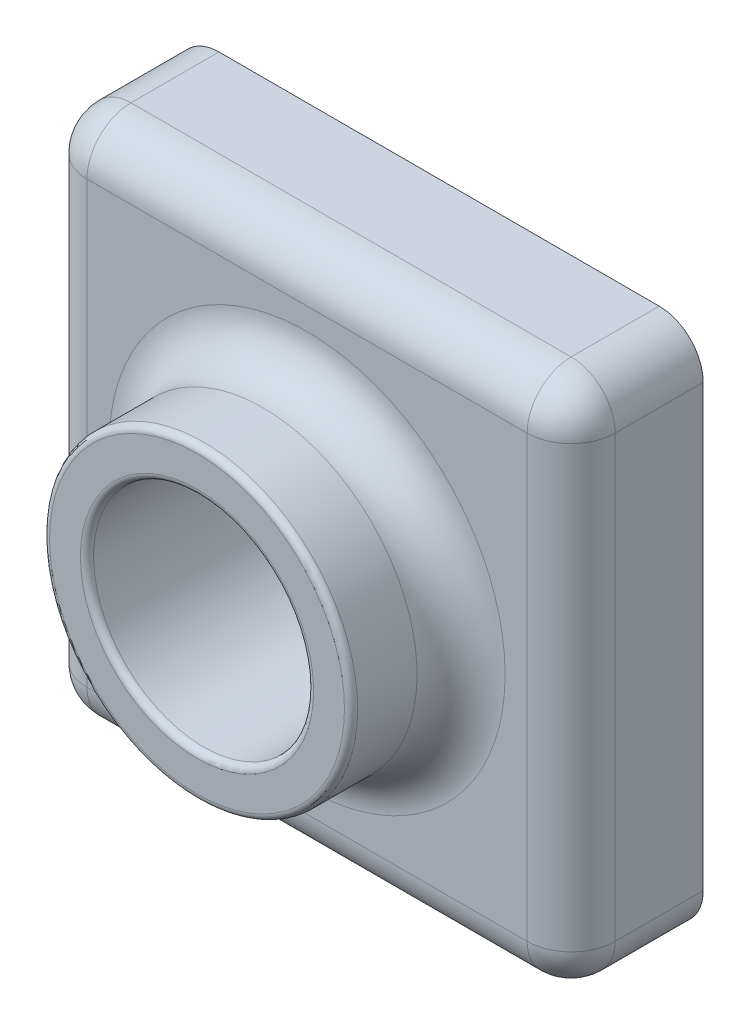
ISO-10303-21;
HEADER;
FILE_DESCRIPTION(('STEP AP214'),'2;1');
FILE_NAME('part.step','',(''),(''),'','','');
FILE_SCHEMA(('AUTOMOTIVE_DESIGN { 1 0 10303 214 1 1 1 1 }'));
ENDSEC;
DATA;
#1=APPLICATION_CONTEXT('core data for automotive mechanical design processes');
#2=APPLICATION_PROTOCOL_DEFINITION('international standard','automotive_design',2000,#1);
#3=PRODUCT_CONTEXT('',#1,'mechanical');
#4=PRODUCT('Part','Part','',(#3));
#5=PRODUCT_RELATED_PRODUCT_CATEGORY('part','',(#4));
#6=PRODUCT_DEFINITION_FORMATION('','',#4);
#7=PRODUCT_DEFINITION_CONTEXT('part definition',#1,'design');
#8=PRODUCT_DEFINITION('design','',#6,#7);
#9=PRODUCT_DEFINITION_SHAPE('','',#8);
#10=(LENGTH_UNIT() NAMED_UNIT(*) SI_UNIT(.MILLI.,.METRE.));
#11=(NAMED_UNIT(*) PLANE_ANGLE_UNIT() SI_UNIT($,.RADIAN.));
#12=(NAMED_UNIT(*) SI_UNIT($,.STERADIAN.) SOLID_ANGLE_UNIT());
#13=UNCERTAINTY_MEASURE_WITH_UNIT(LENGTH_MEASURE(1.E-05),#10,'distance_accuracy_value','');
#14=(GEOMETRIC_REPRESENTATION_CONTEXT(3) GLOBAL_UNCERTAINTY_ASSIGNED_CONTEXT((#13)) GLOBAL_UNIT_ASSIGNED_CONTEXT((#10,
#11,#12)) REPRESENTATION_CONTEXT('',''));
#15=CARTESIAN_POINT('',(0.,0.,0.));
#16=DIRECTION('',(0.,0.,1.));
#17=DIRECTION('',(1.,0.,0.));
#18=AXIS2_PLACEMENT_3D('',#15,#16,#17);
#19=CARTESIAN_POINT('',(0.,0.,0.));
#20=DIRECTION('',(0.,0.,-1.));
#21=DIRECTION('',(-1.,0.,0.));
#22=AXIS2_PLACEMENT_3D('',#19,#20,#21);
#23=PLANE('',#22);
#24=DIRECTION('',(1.,0.,0.));
#25=VECTOR('',#24,1.);
#26=CARTESIAN_POINT('',(0.,-120.,0.));
#27=LINE('',#26,#25);
#28=CARTESIAN_POINT('',(-110.,-120.,0.));
#29=VERTEX_POINT('',#28);
#30=CARTESIAN_POINT('',(-9.99999999999998,-120.,0.));
#31=VERTEX_POINT('',#30);
#32=EDGE_CURVE('E275',#29,#31,#27,.T.);
#33=ORIENTED_EDGE('',*,*,#32,.F.);
#34=CARTESIAN_POINT('',(-110.,-110.,0.));
#35=DIRECTION('',(0.,0.,-1.));
#36=DIRECTION('',(-1.,0.,0.));
#37=AXIS2_PLACEMENT_3D('',#34,#35,#36);
#38=CIRCLE('',#37,10.);
#39=CARTESIAN_POINT('',(-120.,-110.,0.));
#40=VERTEX_POINT('',#39);
#41=EDGE_CURVE('E319',#29,#40,#38,.T.);
#42=ORIENTED_EDGE('',*,*,#41,.T.);
#43=DIRECTION('',(0.,-1.,0.));
#44=VECTOR('',#43,1.);
#45=CARTESIAN_POINT('',(-120.,0.,0.));
#46=LINE('',#45,#44);
#47=CARTESIAN_POINT('',(-120.,-10.,0.));
#48=VERTEX_POINT('',#47);
#49=EDGE_CURVE('E271',#48,#40,#46,.T.);
#50=ORIENTED_EDGE('',*,*,#49,.F.);
#51=CARTESIAN_POINT('',(-110.,-10.,0.));
#52=DIRECTION('',(0.,0.,-1.));
#53=DIRECTION('',(-1.,0.,0.));
#54=AXIS2_PLACEMENT_3D('',#51,#52,#53);
#55=CIRCLE('',#54,10.);
#56=CARTESIAN_POINT('',(-110.,0.,0.));
#57=VERTEX_POINT('',#56);
#58=EDGE_CURVE('E310',#48,#57,#55,.T.);
#59=ORIENTED_EDGE('',*,*,#58,.T.);
#60=DIRECTION('',(-1.,0.,0.));
#61=VECTOR('',#60,1.);
#62=CARTESIAN_POINT('',(0.,0.,0.));
#63=LINE('',#62,#61);
#64=CARTESIAN_POINT('',(-10.,0.,0.));
#65=VERTEX_POINT('',#64);
#66=EDGE_CURVE('E267',#65,#57,#63,.T.);
#67=ORIENTED_EDGE('',*,*,#66,.F.);
#68=CARTESIAN_POINT('',(-10.,-10.,0.));
#69=DIRECTION('',(0.,0.,-1.));
#70=DIRECTION('',(-1.,0.,0.));
#71=AXIS2_PLACEMENT_3D('',#68,#69,#70);
#72=CIRCLE('',#71,10.);
#73=CARTESIAN_POINT('',(0.,-10.,0.));
#74=VERTEX_POINT('',#73);
#75=EDGE_CURVE('E313',#65,#74,#72,.T.);
#76=ORIENTED_EDGE('',*,*,#75,.T.);
#77=DIRECTION('',(0.,1.,0.));
#78=VECTOR('',#77,1.);
#79=CARTESIAN_POINT('',(0.,0.,0.));
#80=LINE('',#79,#78);
#81=CARTESIAN_POINT('',(0.,-110.,0.));
#82=VERTEX_POINT('',#81);
#83=EDGE_CURVE('E262',#82,#74,#80,.T.);
#84=ORIENTED_EDGE('',*,*,#83,.F.);
#85=CARTESIAN_POINT('',(-9.99999999999999,-110.,0.));
#86=DIRECTION('',(0.,0.,-1.));
#87=DIRECTION('',(-1.,0.,0.));
#88=AXIS2_PLACEMENT_3D('',#85,#86,#87);
#89=CIRCLE('',#88,10.);
#90=EDGE_CURVE('E316',#82,#31,#89,.T.);
#91=ORIENTED_EDGE('',*,*,#90,.T.);
#92=EDGE_LOOP('',(#33,#42,#50,#59,#67,#76,#84,#91));
#93=FACE_BOUND('',#92,.T.);
#94=CARTESIAN_POINT('',(-110.,-110.,0.));
#95=DIRECTION('',(0.,0.,-1.));
#96=DIRECTION('',(-1.,0.,0.));
#97=AXIS2_PLACEMENT_3D('',#94,#95,#96);
#98=CIRCLE('',#97,8.);
#99=CARTESIAN_POINT('',(-110.,-118.,0.));
#100=VERTEX_POINT('',#99);
#101=CARTESIAN_POINT('',(-118.,-110.,0.));
#102=VERTEX_POINT('',#101);
#103=EDGE_CURVE('E231',#100,#102,#98,.T.);
#104=ORIENTED_EDGE('',*,*,#103,.F.);
#105=DIRECTION('',(1.,0.,0.));
#106=VECTOR('',#105,1.);
#107=CARTESIAN_POINT('',(0.,-118.,0.));
#108=LINE('',#107,#106);
#109=CARTESIAN_POINT('',(-9.99999999999998,-118.,0.));
#110=VERTEX_POINT('',#109);
#111=EDGE_CURVE('E233',#100,#110,#108,.T.);
#112=ORIENTED_EDGE('',*,*,#111,.T.);
#113=CARTESIAN_POINT('',(-9.99999999999999,-110.,0.));
#114=DIRECTION('',(0.,0.,-1.));
#115=DIRECTION('',(-1.,0.,0.));
#116=AXIS2_PLACEMENT_3D('',#113,#114,#115);
#117=CIRCLE('',#116,8.);
#118=CARTESIAN_POINT('',(-1.99999999999999,-110.,0.));
#119=VERTEX_POINT('',#118);
#120=EDGE_CURVE('E228',#119,#110,#117,.T.);
#121=ORIENTED_EDGE('',*,*,#120,.F.);
#122=DIRECTION('',(0.,1.,0.));
#123=VECTOR('',#122,1.);
#124=CARTESIAN_POINT('',(-2.,0.,0.));
#125=LINE('',#124,#123);
#126=CARTESIAN_POINT('',(-2.,-10.,0.));
#127=VERTEX_POINT('',#126);
#128=EDGE_CURVE('E55',#119,#127,#125,.T.);
#129=ORIENTED_EDGE('',*,*,#128,.T.);
#130=CARTESIAN_POINT('',(-10.,-10.,0.));
#131=DIRECTION('',(0.,0.,-1.));
#132=DIRECTION('',(-1.,0.,0.));
#133=AXIS2_PLACEMENT_3D('',#130,#131,#132);
#134=CIRCLE('',#133,8.);
#135=CARTESIAN_POINT('',(-10.,-2.,0.));
#136=VERTEX_POINT('',#135);
#137=EDGE_CURVE('E232',#136,#127,#134,.T.);
#138=ORIENTED_EDGE('',*,*,#137,.F.);
#139=DIRECTION('',(-1.,0.,0.));
#140=VECTOR('',#139,1.);
#141=CARTESIAN_POINT('',(0.,-2.,0.));
#142=LINE('',#141,#140);
#143=CARTESIAN_POINT('',(-110.,-2.,0.));
#144=VERTEX_POINT('',#143);
#145=EDGE_CURVE('E226',#136,#144,#142,.T.);
#146=ORIENTED_EDGE('',*,*,#145,.T.);
#147=CARTESIAN_POINT('',(-110.,-10.,0.));
#148=DIRECTION('',(0.,0.,-1.));
#149=DIRECTION('',(-1.,0.,0.));
#150=AXIS2_PLACEMENT_3D('',#147,#148,#149);
#151=CIRCLE('',#150,8.);
#152=CARTESIAN_POINT('',(-118.,-10.,0.));
#153=VERTEX_POINT('',#152);
#154=EDGE_CURVE('E245',#153,#144,#151,.T.);
#155=ORIENTED_EDGE('',*,*,#154,.F.);
#156=DIRECTION('',(0.,-1.,0.));
#157=VECTOR('',#156,1.);
#158=CARTESIAN_POINT('',(-118.,0.,0.));
#159=LINE('',#158,#157);
#160=EDGE_CURVE('E238',#153,#102,#159,.T.);
#161=ORIENTED_EDGE('',*,*,#160,.T.);
#162=EDGE_LOOP('',(#104,#112,#121,#129,#138,#146,#155,#161));
#163=FACE_BOUND('',#162,.T.);
#164=ADVANCED_FACE('F39',(#93,#163),#23,.T.);
#165=CARTESIAN_POINT('',(0.,0.,30.));
#166=DIRECTION('',(-1.,0.,0.));
#167=DIRECTION('',(0.,-1.,0.));
#168=AXIS2_PLACEMENT_3D('',#165,#166,#167);
#169=PLANE('',#168);
#170=DIRECTION('',(0.,1.,0.));
#171=VECTOR('',#170,1.);
#172=CARTESIAN_POINT('',(0.,0.,20.));
#173=LINE('',#172,#171);
#174=CARTESIAN_POINT('',(0.,-10.,20.));
#175=VERTEX_POINT('',#174);
#176=CARTESIAN_POINT('',(0.,-110.,20.));
#177=VERTEX_POINT('',#176);
#178=EDGE_CURVE('E334',#175,#177,#173,.F.);
#179=ORIENTED_EDGE('',*,*,#178,.T.);
#180=DIRECTION('',(0.,0.,-1.));
#181=VECTOR('',#180,1.);
#182=CARTESIAN_POINT('',(0.,-110.,30.));
#183=LINE('',#182,#181);
#184=EDGE_CURVE('E337',#177,#82,#183,.T.);
#185=ORIENTED_EDGE('',*,*,#184,.T.);
#186=ORIENTED_EDGE('',*,*,#83,.T.);
#187=DIRECTION('',(0.,0.,-1.));
#188=VECTOR('',#187,1.);
#189=CARTESIAN_POINT('',(0.,-10.,30.));
#190=LINE('',#189,#188);
#191=EDGE_CURVE('E331',#74,#175,#190,.F.);
#192=ORIENTED_EDGE('',*,*,#191,.T.);
#193=EDGE_LOOP('',(#179,#185,#186,#192));
#194=FACE_BOUND('',#193,.T.);
#195=ADVANCED_FACE('F440',(#194),#169,.F.);
#196=CARTESIAN_POINT('',(0.,0.,30.));
#197=DIRECTION('',(0.,-1.,0.));
#198=DIRECTION('',(0.,0.,-1.));
#199=AXIS2_PLACEMENT_3D('',#196,#197,#198);
#200=PLANE('',#199);
#201=DIRECTION('',(-1.,0.,0.));
#202=VECTOR('',#201,1.);
#203=CARTESIAN_POINT('',(0.,0.,20.));
#204=LINE('',#203,#202);
#205=CARTESIAN_POINT('',(-110.,0.,20.));
#206=VERTEX_POINT('',#205);
#207=CARTESIAN_POINT('',(-10.,0.,20.));
#208=VERTEX_POINT('',#207);
#209=EDGE_CURVE('E63',#206,#208,#204,.F.);
#210=ORIENTED_EDGE('',*,*,#209,.T.);
#211=DIRECTION('',(0.,0.,-1.));
#212=VECTOR('',#211,1.);
#213=CARTESIAN_POINT('',(-10.,0.,30.));
#214=LINE('',#213,#212);
#215=EDGE_CURVE('E345',#208,#65,#214,.T.);
#216=ORIENTED_EDGE('',*,*,#215,.T.);
#217=ORIENTED_EDGE('',*,*,#66,.T.);
#218=DIRECTION('',(0.,0.,-1.));
#219=VECTOR('',#218,1.);
#220=CARTESIAN_POINT('',(-110.,0.,30.));
#221=LINE('',#220,#219);
#222=EDGE_CURVE('E342',#57,#206,#221,.F.);
#223=ORIENTED_EDGE('',*,*,#222,.T.);
#224=EDGE_LOOP('',(#210,#216,#217,#223));
#225=FACE_BOUND('',#224,.T.);
#226=ADVANCED_FACE('F445',(#225),#200,.F.);
#227=CARTESIAN_POINT('',(-120.,0.,30.));
#228=DIRECTION('',(1.,0.,0.));
#229=DIRECTION('',(0.,1.,0.));
#230=AXIS2_PLACEMENT_3D('',#227,#228,#229);
#231=PLANE('',#230);
#232=ORIENTED_EDGE('',*,*,#49,.T.);
#233=DIRECTION('',(0.,0.,-1.));
#234=VECTOR('',#233,1.);
#235=CARTESIAN_POINT('',(-120.,-110.,30.));
#236=LINE('',#235,#234);
#237=CARTESIAN_POINT('',(-120.,-110.,20.));
#238=VERTEX_POINT('',#237);
#239=EDGE_CURVE('E328',#40,#238,#236,.F.);
#240=ORIENTED_EDGE('',*,*,#239,.T.);
#241=DIRECTION('',(0.,-1.,0.));
#242=VECTOR('',#241,1.);
#243=CARTESIAN_POINT('',(-120.,0.,20.));
#244=LINE('',#243,#242);
#245=CARTESIAN_POINT('',(-120.,-10.,20.));
#246=VERTEX_POINT('',#245);
#247=EDGE_CURVE('E325',#238,#246,#244,.F.);
#248=ORIENTED_EDGE('',*,*,#247,.T.);
#249=DIRECTION('',(0.,0.,-1.));
#250=VECTOR('',#249,1.);
#251=CARTESIAN_POINT('',(-120.,-10.,30.));
#252=LINE('',#251,#250);
#253=EDGE_CURVE('E322',#246,#48,#252,.T.);
#254=ORIENTED_EDGE('',*,*,#253,.T.);
#255=EDGE_LOOP('',(#232,#240,#248,#254));
#256=FACE_BOUND('',#255,.T.);
#257=ADVANCED_FACE('F918',(#256),#231,.F.);
#258=CARTESIAN_POINT('',(0.,-120.,30.));
#259=DIRECTION('',(0.,1.,0.));
#260=DIRECTION('',(-1.,0.,0.));
#261=AXIS2_PLACEMENT_3D('',#258,#259,#260);
#262=PLANE('',#261);
#263=DIRECTION('',(1.,0.,0.));
#264=VECTOR('',#263,1.);
#265=CARTESIAN_POINT('',(0.,-120.,20.));
#266=LINE('',#265,#264);
#267=CARTESIAN_POINT('',(-9.99999999999998,-120.,20.));
#268=VERTEX_POINT('',#267);
#269=CARTESIAN_POINT('',(-110.,-120.,20.));
#270=VERTEX_POINT('',#269);
#271=EDGE_CURVE('E300',#268,#270,#266,.F.);
#272=ORIENTED_EDGE('',*,*,#271,.T.);
#273=DIRECTION('',(0.,0.,-1.));
#274=VECTOR('',#273,1.);
#275=CARTESIAN_POINT('',(-110.,-120.,30.));
#276=LINE('',#275,#274);
#277=EDGE_CURVE('E306',#270,#29,#276,.T.);
#278=ORIENTED_EDGE('',*,*,#277,.T.);
#279=ORIENTED_EDGE('',*,*,#32,.T.);
#280=DIRECTION('',(0.,0.,-1.));
#281=VECTOR('',#280,1.);
#282=CARTESIAN_POINT('',(-9.99999999999998,-120.,30.));
#283=LINE('',#282,#281);
#284=EDGE_CURVE('E303',#31,#268,#283,.F.);
#285=ORIENTED_EDGE('',*,*,#284,.T.);
#286=EDGE_LOOP('',(#272,#278,#279,#285));
#287=FACE_BOUND('',#286,.T.);
#288=ADVANCED_FACE('F434',(#287),#262,.F.);
#289=CARTESIAN_POINT('',(0.,0.,30.));
#290=DIRECTION('',(0.,0.,-1.));
#291=DIRECTION('',(-1.,0.,0.));
#292=AXIS2_PLACEMENT_3D('',#289,#290,#291);
#293=PLANE('',#292);
#294=CARTESIAN_POINT('',(-60.,-60.,30.));
#295=DIRECTION('',(0.,0.,-1.));
#296=DIRECTION('',(-1.,0.,0.));
#297=AXIS2_PLACEMENT_3D('',#294,#295,#296);
#298=CIRCLE('',#297,45.);
#299=CARTESIAN_POINT('',(-105.,-60.,30.));
#300=VERTEX_POINT('',#299);
#301=EDGE_CURVE('E296',#300,#300,#298,.T.);
#302=ORIENTED_EDGE('',*,*,#301,.T.);
#303=EDGE_LOOP('',(#302));
#304=FACE_BOUND('',#303,.T.);
#305=DIRECTION('',(-1.,0.,0.));
#306=VECTOR('',#305,1.);
#307=CARTESIAN_POINT('',(0.,-10.,30.));
#308=LINE('',#307,#306);
#309=CARTESIAN_POINT('',(-10.,-10.,30.));
#310=VERTEX_POINT('',#309);
#311=CARTESIAN_POINT('',(-110.,-10.,30.));
#312=VERTEX_POINT('',#311);
#313=EDGE_CURVE('E283',#310,#312,#308,.T.);
#314=ORIENTED_EDGE('',*,*,#313,.T.);
#315=DIRECTION('',(0.,-1.,0.));
#316=VECTOR('',#315,1.);
#317=CARTESIAN_POINT('',(-110.,0.,30.));
#318=LINE('',#317,#316);
#319=CARTESIAN_POINT('',(-110.,-110.,30.));
#320=VERTEX_POINT('',#319);
#321=EDGE_CURVE('E292',#312,#320,#318,.T.);
#322=ORIENTED_EDGE('',*,*,#321,.T.);
#323=DIRECTION('',(1.,0.,0.));
#324=VECTOR('',#323,1.);
#325=CARTESIAN_POINT('',(0.,-110.,30.));
#326=LINE('',#325,#324);
#327=CARTESIAN_POINT('',(-9.99999999999999,-110.,30.));
#328=VERTEX_POINT('',#327);
#329=EDGE_CURVE('E289',#320,#328,#326,.T.);
#330=ORIENTED_EDGE('',*,*,#329,.T.);
#331=DIRECTION('',(0.,1.,0.));
#332=VECTOR('',#331,1.);
#333=CARTESIAN_POINT('',(-10.,0.,30.));
#334=LINE('',#333,#332);
#335=EDGE_CURVE('E286',#328,#310,#334,.T.);
#336=ORIENTED_EDGE('',*,*,#335,.T.);
#337=EDGE_LOOP('',(#314,#322,#330,#336));
#338=FACE_BOUND('',#337,.T.);
#339=ADVANCED_FACE('F425',(#304,#338),#293,.F.);
#340=CARTESIAN_POINT('',(-60.,-60.,0.));
#341=DIRECTION('',(0.,0.,-1.));
#342=DIRECTION('',(-1.,0.,0.));
#343=AXIS2_PLACEMENT_3D('',#340,#341,#342);
#344=CIRCLE('',#343,27.);
#345=CARTESIAN_POINT('',(-87.,-60.,0.));
#346=VERTEX_POINT('',#345);
#347=EDGE_CURVE('E227',#346,#346,#344,.F.);
#348=ORIENTED_EDGE('',*,*,#347,.F.);
#349=EDGE_LOOP('',(#348));
#350=FACE_BOUND('',#349,.T.);
#351=CARTESIAN_POINT('',(-60.,-60.,0.));
#352=DIRECTION('',(0.,0.,1.));
#353=DIRECTION('',(1.,0.,0.));
#354=AXIS2_PLACEMENT_3D('',#351,#352,#353);
#355=CIRCLE('',#354,25.);
#356=CARTESIAN_POINT('',(-35.,-60.,0.));
#357=VERTEX_POINT('',#356);
#358=EDGE_CURVE('E258',#357,#357,#355,.T.);
#359=ORIENTED_EDGE('',*,*,#358,.T.);
#360=EDGE_LOOP('',(#359));
#361=FACE_BOUND('',#360,.T.);
#362=ADVANCED_FACE('F422',(#350,#361),#23,.T.);
#363=CARTESIAN_POINT('',(-60.,-60.,55.));
#364=DIRECTION('',(0.,0.,-1.));
#365=DIRECTION('',(-1.,0.,0.));
#366=AXIS2_PLACEMENT_3D('',#363,#364,#365);
#367=CYLINDRICAL_SURFACE('',#366,35.);
#368=CARTESIAN_POINT('',(-60.,-60.,53.5));
#369=DIRECTION('',(0.,0.,1.));
#370=DIRECTION('',(1.,0.,0.));
#371=AXIS2_PLACEMENT_3D('',#368,#369,#370);
#372=CIRCLE('',#371,35.);
#373=CARTESIAN_POINT('',(-25.,-60.,53.5));
#374=VERTEX_POINT('',#373);
#375=EDGE_CURVE('E11',#374,#374,#372,.F.);
#376=ORIENTED_EDGE('',*,*,#375,.T.);
#377=EDGE_LOOP('',(#376));
#378=FACE_BOUND('',#377,.T.);
#379=CARTESIAN_POINT('',(-60.,-60.,40.));
#380=DIRECTION('',(0.,0.,-1.));
#381=DIRECTION('',(-1.,0.,0.));
#382=AXIS2_PLACEMENT_3D('',#379,#380,#381);
#383=CIRCLE('',#382,35.);
#384=CARTESIAN_POINT('',(-95.,-60.,40.));
#385=VERTEX_POINT('',#384);
#386=EDGE_CURVE('E279',#385,#385,#383,.F.);
#387=ORIENTED_EDGE('',*,*,#386,.T.);
#388=EDGE_LOOP('',(#387));
#389=FACE_BOUND('',#388,.T.);
#390=ADVANCED_FACE('F424',(#378,#389),#367,.T.);
#391=CARTESIAN_POINT('',(-60.,-60.,55.));
#392=DIRECTION('',(0.,0.,1.));
#393=DIRECTION('',(1.,0.,0.));
#394=AXIS2_PLACEMENT_3D('',#391,#392,#393);
#395=PLANE('',#394);
#396=CARTESIAN_POINT('',(-60.,-60.,55.));
#397=DIRECTION('',(0.,0.,1.));
#398=DIRECTION('',(1.,0.,0.));
#399=AXIS2_PLACEMENT_3D('',#396,#397,#398);
#400=CIRCLE('',#399,26.5);
#401=CARTESIAN_POINT('',(-33.5,-60.,55.));
#402=VERTEX_POINT('',#401);
#403=EDGE_CURVE('E48',#402,#402,#400,.F.);
#404=ORIENTED_EDGE('',*,*,#403,.T.);
#405=EDGE_LOOP('',(#404));
#406=FACE_BOUND('',#405,.T.);
#407=CARTESIAN_POINT('',(-60.,-60.,55.));
#408=DIRECTION('',(0.,0.,1.));
#409=DIRECTION('',(1.,0.,0.));
#410=AXIS2_PLACEMENT_3D('',#407,#408,#409);
#411=CIRCLE('',#410,33.5);
#412=CARTESIAN_POINT('',(-26.5,-60.,55.));
#413=VERTEX_POINT('',#412);
#414=EDGE_CURVE('E399',#413,#413,#411,.T.);
#415=ORIENTED_EDGE('',*,*,#414,.T.);
#416=EDGE_LOOP('',(#415));
#417=FACE_BOUND('',#416,.T.);
#418=ADVANCED_FACE('F406',(#406,#417),#395,.T.);
#419=CARTESIAN_POINT('',(-60.,-60.,0.));
#420=DIRECTION('',(0.,0.,1.));
#421=DIRECTION('',(1.,0.,0.));
#422=AXIS2_PLACEMENT_3D('',#419,#420,#421);
#423=CYLINDRICAL_SURFACE('',#422,25.);
#424=CARTESIAN_POINT('',(-60.,-60.,53.5));
#425=DIRECTION('',(0.,0.,1.));
#426=DIRECTION('',(1.,0.,0.));
#427=AXIS2_PLACEMENT_3D('',#424,#425,#426);
#428=CIRCLE('',#427,25.);
#429=CARTESIAN_POINT('',(-35.,-60.,53.5));
#430=VERTEX_POINT('',#429);
#431=EDGE_CURVE('E348',#430,#430,#428,.T.);
#432=ORIENTED_EDGE('',*,*,#431,.T.);
#433=EDGE_LOOP('',(#432));
#434=FACE_BOUND('',#433,.T.);
#435=ORIENTED_EDGE('',*,*,#358,.F.);
#436=EDGE_LOOP('',(#435));
#437=FACE_BOUND('',#436,.T.);
#438=ADVANCED_FACE('F415',(#434,#437),#423,.F.);
#439=CARTESIAN_POINT('',(-60.,-60.,40.));
#440=DIRECTION('',(0.,0.,-1.));
#441=DIRECTION('',(-1.,0.,0.));
#442=AXIS2_PLACEMENT_3D('',#439,#440,#441);
#443=TOROIDAL_SURFACE('',#442,45.,10.);
#444=ORIENTED_EDGE('',*,*,#301,.F.);
#445=EDGE_LOOP('',(#444));
#446=FACE_BOUND('',#445,.T.);
#447=ORIENTED_EDGE('',*,*,#386,.F.);
#448=EDGE_LOOP('',(#447));
#449=FACE_BOUND('',#448,.T.);
#450=ADVANCED_FACE('F418',(#446,#449),#443,.F.);
#451=CARTESIAN_POINT('',(-10.,-10.,30.));
#452=DIRECTION('',(0.,0.,-1.));
#453=DIRECTION('',(-1.,0.,0.));
#454=AXIS2_PLACEMENT_3D('',#451,#452,#453);
#455=CYLINDRICAL_SURFACE('',#454,10.);
#456=CARTESIAN_POINT('',(-10.,-10.,20.));
#457=DIRECTION('',(0.,0.,1.));
#458=DIRECTION('',(1.,0.,0.));
#459=AXIS2_PLACEMENT_3D('',#456,#457,#458);
#460=CIRCLE('',#459,10.);
#461=EDGE_CURVE('E263',#175,#208,#460,.T.);
#462=ORIENTED_EDGE('',*,*,#461,.F.);
#463=ORIENTED_EDGE('',*,*,#191,.F.);
#464=ORIENTED_EDGE('',*,*,#75,.F.);
#465=ORIENTED_EDGE('',*,*,#215,.F.);
#466=EDGE_LOOP('',(#462,#463,#464,#465));
#467=FACE_BOUND('',#466,.T.);
#468=ADVANCED_FACE('F626',(#467),#455,.T.);
#469=CARTESIAN_POINT('',(-10.,-10.,20.));
#470=DIRECTION('',(0.,0.,1.));
#471=DIRECTION('',(1.,0.,0.));
#472=AXIS2_PLACEMENT_3D('',#469,#470,#471);
#473=SPHERICAL_SURFACE('',#472,10.);
#474=CARTESIAN_POINT('',(-10.,-10.,20.));
#475=DIRECTION('',(0.,1.,0.));
#476=DIRECTION('',(-1.,0.,0.));
#477=AXIS2_PLACEMENT_3D('',#474,#475,#476);
#478=CIRCLE('',#477,10.);
#479=EDGE_CURVE('E385',#175,#310,#478,.F.);
#480=ORIENTED_EDGE('',*,*,#479,.F.);
#481=ORIENTED_EDGE('',*,*,#461,.T.);
#482=CARTESIAN_POINT('',(-10.,-10.,20.));
#483=DIRECTION('',(1.,0.,0.));
#484=DIRECTION('',(0.,0.,-1.));
#485=AXIS2_PLACEMENT_3D('',#482,#483,#484);
#486=CIRCLE('',#485,10.);
#487=EDGE_CURVE('E389',#310,#208,#486,.F.);
#488=ORIENTED_EDGE('',*,*,#487,.F.);
#489=EDGE_LOOP('',(#480,#481,#488));
#490=FACE_BOUND('',#489,.T.);
#491=ADVANCED_FACE('F635',(#490),#473,.T.);
#492=CARTESIAN_POINT('',(-110.,-10.,30.));
#493=DIRECTION('',(0.,0.,-1.));
#494=DIRECTION('',(-1.,0.,0.));
#495=AXIS2_PLACEMENT_3D('',#492,#493,#494);
#496=CYLINDRICAL_SURFACE('',#495,10.);
#497=ORIENTED_EDGE('',*,*,#58,.F.);
#498=ORIENTED_EDGE('',*,*,#253,.F.);
#499=CARTESIAN_POINT('',(-110.,-10.,20.));
#500=DIRECTION('',(0.,0.,1.));
#501=DIRECTION('',(1.,0.,0.));
#502=AXIS2_PLACEMENT_3D('',#499,#500,#501);
#503=CIRCLE('',#502,10.);
#504=EDGE_CURVE('E381',#206,#246,#503,.T.);
#505=ORIENTED_EDGE('',*,*,#504,.F.);
#506=ORIENTED_EDGE('',*,*,#222,.F.);
#507=EDGE_LOOP('',(#497,#498,#505,#506));
#508=FACE_BOUND('',#507,.T.);
#509=ADVANCED_FACE('F643',(#508),#496,.T.);
#510=CARTESIAN_POINT('',(0.,-10.,20.));
#511=DIRECTION('',(-1.,0.,0.));
#512=DIRECTION('',(0.,0.,1.));
#513=AXIS2_PLACEMENT_3D('',#510,#511,#512);
#514=CYLINDRICAL_SURFACE('',#513,10.);
#515=ORIENTED_EDGE('',*,*,#487,.T.);
#516=ORIENTED_EDGE('',*,*,#209,.F.);
#517=CARTESIAN_POINT('',(-110.,-10.,20.));
#518=DIRECTION('',(-1.,0.,0.));
#519=DIRECTION('',(0.,0.,1.));
#520=AXIS2_PLACEMENT_3D('',#517,#518,#519);
#521=CIRCLE('',#520,10.);
#522=EDGE_CURVE('E377',#312,#206,#521,.T.);
#523=ORIENTED_EDGE('',*,*,#522,.F.);
#524=ORIENTED_EDGE('',*,*,#313,.F.);
#525=EDGE_LOOP('',(#515,#516,#523,#524));
#526=FACE_BOUND('',#525,.T.);
#527=ADVANCED_FACE('F651',(#526),#514,.T.);
#528=CARTESIAN_POINT('',(-10.,0.,20.));
#529=DIRECTION('',(0.,1.,0.));
#530=DIRECTION('',(-1.,0.,0.));
#531=AXIS2_PLACEMENT_3D('',#528,#529,#530);
#532=CYLINDRICAL_SURFACE('',#531,10.);
#533=ORIENTED_EDGE('',*,*,#479,.T.);
#534=ORIENTED_EDGE('',*,*,#335,.F.);
#535=CARTESIAN_POINT('',(-9.99999999999999,-110.,20.));
#536=DIRECTION('',(0.,-1.,0.));
#537=DIRECTION('',(0.,0.,-1.));
#538=AXIS2_PLACEMENT_3D('',#535,#536,#537);
#539=CIRCLE('',#538,10.);
#540=EDGE_CURVE('E373',#177,#328,#539,.T.);
#541=ORIENTED_EDGE('',*,*,#540,.F.);
#542=ORIENTED_EDGE('',*,*,#178,.F.);
#543=EDGE_LOOP('',(#533,#534,#541,#542));
#544=FACE_BOUND('',#543,.T.);
#545=ADVANCED_FACE('F659',(#544),#532,.T.);
#546=CARTESIAN_POINT('',(-9.99999999999999,-110.,30.));
#547=DIRECTION('',(0.,0.,-1.));
#548=DIRECTION('',(-1.,0.,0.));
#549=AXIS2_PLACEMENT_3D('',#546,#547,#548);
#550=CYLINDRICAL_SURFACE('',#549,10.);
#551=ORIENTED_EDGE('',*,*,#90,.F.);
#552=ORIENTED_EDGE('',*,*,#184,.F.);
#553=CARTESIAN_POINT('',(-9.99999999999999,-110.,20.));
#554=DIRECTION('',(0.,0.,1.));
#555=DIRECTION('',(1.,0.,0.));
#556=AXIS2_PLACEMENT_3D('',#553,#554,#555);
#557=CIRCLE('',#556,10.);
#558=EDGE_CURVE('E369',#268,#177,#557,.T.);
#559=ORIENTED_EDGE('',*,*,#558,.F.);
#560=ORIENTED_EDGE('',*,*,#284,.F.);
#561=EDGE_LOOP('',(#551,#552,#559,#560));
#562=FACE_BOUND('',#561,.T.);
#563=ADVANCED_FACE('F667',(#562),#550,.T.);
#564=CARTESIAN_POINT('',(-110.,-10.,20.));
#565=DIRECTION('',(0.,0.,1.));
#566=DIRECTION('',(1.,0.,0.));
#567=AXIS2_PLACEMENT_3D('',#564,#565,#566);
#568=SPHERICAL_SURFACE('',#567,10.);
#569=ORIENTED_EDGE('',*,*,#522,.T.);
#570=ORIENTED_EDGE('',*,*,#504,.T.);
#571=CARTESIAN_POINT('',(-110.,-10.,20.));
#572=DIRECTION('',(0.,1.,0.));
#573=DIRECTION('',(-1.,0.,0.));
#574=AXIS2_PLACEMENT_3D('',#571,#572,#573);
#575=CIRCLE('',#574,10.);
#576=EDGE_CURVE('E365',#312,#246,#575,.F.);
#577=ORIENTED_EDGE('',*,*,#576,.F.);
#578=EDGE_LOOP('',(#569,#570,#577));
#579=FACE_BOUND('',#578,.T.);
#580=ADVANCED_FACE('F675',(#579),#568,.T.);
#581=CARTESIAN_POINT('',(-9.99999999999999,-110.,20.));
#582=DIRECTION('',(0.,0.,1.));
#583=DIRECTION('',(1.,0.,0.));
#584=AXIS2_PLACEMENT_3D('',#581,#582,#583);
#585=SPHERICAL_SURFACE('',#584,10.);
#586=ORIENTED_EDGE('',*,*,#558,.T.);
#587=ORIENTED_EDGE('',*,*,#540,.T.);
#588=CARTESIAN_POINT('',(-9.99999999999999,-110.,20.));
#589=DIRECTION('',(1.,0.,0.));
#590=DIRECTION('',(0.,1.,0.));
#591=AXIS2_PLACEMENT_3D('',#588,#589,#590);
#592=CIRCLE('',#591,10.);
#593=EDGE_CURVE('E361',#268,#328,#592,.F.);
#594=ORIENTED_EDGE('',*,*,#593,.F.);
#595=EDGE_LOOP('',(#586,#587,#594));
#596=FACE_BOUND('',#595,.T.);
#597=ADVANCED_FACE('F683',(#596),#585,.T.);
#598=CARTESIAN_POINT('',(-110.,0.,20.));
#599=DIRECTION('',(0.,-1.,0.));
#600=DIRECTION('',(1.,0.,0.));
#601=AXIS2_PLACEMENT_3D('',#598,#599,#600);
#602=CYLINDRICAL_SURFACE('',#601,10.);
#603=ORIENTED_EDGE('',*,*,#576,.T.);
#604=ORIENTED_EDGE('',*,*,#247,.F.);
#605=CARTESIAN_POINT('',(-110.,-110.,20.));
#606=DIRECTION('',(0.,-1.,0.));
#607=DIRECTION('',(0.,0.,-1.));
#608=AXIS2_PLACEMENT_3D('',#605,#606,#607);
#609=CIRCLE('',#608,10.);
#610=EDGE_CURVE('E357',#320,#238,#609,.T.);
#611=ORIENTED_EDGE('',*,*,#610,.F.);
#612=ORIENTED_EDGE('',*,*,#321,.F.);
#613=EDGE_LOOP('',(#603,#604,#611,#612));
#614=FACE_BOUND('',#613,.T.);
#615=ADVANCED_FACE('F691',(#614),#602,.T.);
#616=CARTESIAN_POINT('',(0.,-110.,20.));
#617=DIRECTION('',(1.,0.,0.));
#618=DIRECTION('',(0.,1.,0.));
#619=AXIS2_PLACEMENT_3D('',#616,#617,#618);
#620=CYLINDRICAL_SURFACE('',#619,10.);
#621=ORIENTED_EDGE('',*,*,#593,.T.);
#622=ORIENTED_EDGE('',*,*,#329,.F.);
#623=CARTESIAN_POINT('',(-110.,-110.,20.));
#624=DIRECTION('',(-1.,0.,0.));
#625=DIRECTION('',(0.,0.,1.));
#626=AXIS2_PLACEMENT_3D('',#623,#624,#625);
#627=CIRCLE('',#626,10.);
#628=EDGE_CURVE('E353',#270,#320,#627,.T.);
#629=ORIENTED_EDGE('',*,*,#628,.F.);
#630=ORIENTED_EDGE('',*,*,#271,.F.);
#631=EDGE_LOOP('',(#621,#622,#629,#630));
#632=FACE_BOUND('',#631,.T.);
#633=ADVANCED_FACE('F699',(#632),#620,.T.);
#634=CARTESIAN_POINT('',(-110.,-110.,20.));
#635=DIRECTION('',(0.,0.,1.));
#636=DIRECTION('',(1.,0.,0.));
#637=AXIS2_PLACEMENT_3D('',#634,#635,#636);
#638=SPHERICAL_SURFACE('',#637,10.);
#639=ORIENTED_EDGE('',*,*,#628,.T.);
#640=ORIENTED_EDGE('',*,*,#610,.T.);
#641=CARTESIAN_POINT('',(-110.,-110.,20.));
#642=DIRECTION('',(0.,0.,1.));
#643=DIRECTION('',(1.,0.,0.));
#644=AXIS2_PLACEMENT_3D('',#641,#642,#643);
#645=CIRCLE('',#644,10.);
#646=EDGE_CURVE('E349',#270,#238,#645,.F.);
#647=ORIENTED_EDGE('',*,*,#646,.F.);
#648=EDGE_LOOP('',(#639,#640,#647));
#649=FACE_BOUND('',#648,.T.);
#650=ADVANCED_FACE('F707',(#649),#638,.T.);
#651=CARTESIAN_POINT('',(-110.,-110.,30.));
#652=DIRECTION('',(0.,0.,-1.));
#653=DIRECTION('',(-1.,0.,0.));
#654=AXIS2_PLACEMENT_3D('',#651,#652,#653);
#655=CYLINDRICAL_SURFACE('',#654,10.);
#656=ORIENTED_EDGE('',*,*,#646,.T.);
#657=ORIENTED_EDGE('',*,*,#239,.F.);
#658=ORIENTED_EDGE('',*,*,#41,.F.);
#659=ORIENTED_EDGE('',*,*,#277,.F.);
#660=EDGE_LOOP('',(#656,#657,#658,#659));
#661=FACE_BOUND('',#660,.T.);
#662=ADVANCED_FACE('F412',(#661),#655,.T.);
#663=CARTESIAN_POINT('',(-60.,-60.,53.5));
#664=DIRECTION('',(0.,0.,1.));
#665=DIRECTION('',(1.,0.,0.));
#666=AXIS2_PLACEMENT_3D('',#663,#664,#665);
#667=TOROIDAL_SURFACE('',#666,26.5,1.5);
#668=ORIENTED_EDGE('',*,*,#403,.F.);
#669=EDGE_LOOP('',(#668));
#670=FACE_BOUND('',#669,.T.);
#671=ORIENTED_EDGE('',*,*,#431,.F.);
#672=EDGE_LOOP('',(#671));
#673=FACE_BOUND('',#672,.T.);
#674=ADVANCED_FACE('F409',(#670,#673),#667,.T.);
#675=CARTESIAN_POINT('',(-60.,-60.,53.5));
#676=DIRECTION('',(0.,0.,1.));
#677=DIRECTION('',(1.,0.,0.));
#678=AXIS2_PLACEMENT_3D('',#675,#676,#677);
#679=TOROIDAL_SURFACE('',#678,33.5,1.5);
#680=ORIENTED_EDGE('',*,*,#375,.F.);
#681=EDGE_LOOP('',(#680));
#682=FACE_BOUND('',#681,.T.);
#683=ORIENTED_EDGE('',*,*,#414,.F.);
#684=EDGE_LOOP('',(#683));
#685=FACE_BOUND('',#684,.T.);
#686=ADVANCED_FACE('F41',(#682,#685),#679,.T.);
#687=CARTESIAN_POINT('',(-2.,0.,30.));
#688=DIRECTION('',(-1.,0.,0.));
#689=DIRECTION('',(0.,-1.,0.));
#690=AXIS2_PLACEMENT_3D('',#687,#688,#689);
#691=PLANE('',#690);
#692=DIRECTION('',(0.,-1.,0.));
#693=VECTOR('',#692,1.);
#694=CARTESIAN_POINT('',(-2.,0.,20.));
#695=LINE('',#694,#693);
#696=CARTESIAN_POINT('',(-2.,-10.,20.));
#697=VERTEX_POINT('',#696);
#698=CARTESIAN_POINT('',(-1.99999999999999,-110.,20.));
#699=VERTEX_POINT('',#698);
#700=EDGE_CURVE('E180',#697,#699,#695,.T.);
#701=ORIENTED_EDGE('',*,*,#700,.F.);
#702=DIRECTION('',(0.,0.,1.));
#703=VECTOR('',#702,1.);
#704=CARTESIAN_POINT('',(-2.,-10.,30.));
#705=LINE('',#704,#703);
#706=EDGE_CURVE('E189',#127,#697,#705,.T.);
#707=ORIENTED_EDGE('',*,*,#706,.F.);
#708=ORIENTED_EDGE('',*,*,#128,.F.);
#709=DIRECTION('',(0.,0.,1.));
#710=VECTOR('',#709,1.);
#711=CARTESIAN_POINT('',(-1.99999999999999,-110.,30.));
#712=LINE('',#711,#710);
#713=EDGE_CURVE('E188',#699,#119,#712,.F.);
#714=ORIENTED_EDGE('',*,*,#713,.F.);
#715=EDGE_LOOP('',(#701,#707,#708,#714));
#716=FACE_BOUND('',#715,.T.);
#717=ADVANCED_FACE('F191',(#716),#691,.T.);
#718=CARTESIAN_POINT('',(0.,-2.,30.));
#719=DIRECTION('',(0.,-1.,0.));
#720=DIRECTION('',(0.,0.,-1.));
#721=AXIS2_PLACEMENT_3D('',#718,#719,#720);
#722=PLANE('',#721);
#723=DIRECTION('',(1.,0.,0.));
#724=VECTOR('',#723,1.);
#725=CARTESIAN_POINT('',(0.,-2.,20.));
#726=LINE('',#725,#724);
#727=CARTESIAN_POINT('',(-110.,-2.,20.));
#728=VERTEX_POINT('',#727);
#729=CARTESIAN_POINT('',(-10.,-2.,20.));
#730=VERTEX_POINT('',#729);
#731=EDGE_CURVE('E196',#728,#730,#726,.T.);
#732=ORIENTED_EDGE('',*,*,#731,.F.);
#733=DIRECTION('',(0.,0.,-1.));
#734=VECTOR('',#733,1.);
#735=CARTESIAN_POINT('',(-110.,-2.,30.));
#736=LINE('',#735,#734);
#737=EDGE_CURVE('E531',#144,#728,#736,.F.);
#738=ORIENTED_EDGE('',*,*,#737,.F.);
#739=ORIENTED_EDGE('',*,*,#145,.F.);
#740=DIRECTION('',(0.,0.,-1.));
#741=VECTOR('',#740,1.);
#742=CARTESIAN_POINT('',(-10.,-2.,30.));
#743=LINE('',#742,#741);
#744=EDGE_CURVE('E980',#730,#136,#743,.T.);
#745=ORIENTED_EDGE('',*,*,#744,.F.);
#746=EDGE_LOOP('',(#732,#738,#739,#745));
#747=FACE_BOUND('',#746,.T.);
#748=ADVANCED_FACE('F562',(#747),#722,.T.);
#749=CARTESIAN_POINT('',(-118.,0.,30.));
#750=DIRECTION('',(1.,0.,0.));
#751=DIRECTION('',(0.,1.,0.));
#752=AXIS2_PLACEMENT_3D('',#749,#750,#751);
#753=PLANE('',#752);
#754=ORIENTED_EDGE('',*,*,#160,.F.);
#755=DIRECTION('',(0.,0.,1.));
#756=VECTOR('',#755,1.);
#757=CARTESIAN_POINT('',(-118.,-10.,30.));
#758=LINE('',#757,#756);
#759=CARTESIAN_POINT('',(-118.,-10.,20.));
#760=VERTEX_POINT('',#759);
#761=EDGE_CURVE('E241',#760,#153,#758,.F.);
#762=ORIENTED_EDGE('',*,*,#761,.F.);
#763=DIRECTION('',(0.,1.,0.));
#764=VECTOR('',#763,1.);
#765=CARTESIAN_POINT('',(-118.,0.,20.));
#766=LINE('',#765,#764);
#767=CARTESIAN_POINT('',(-118.,-110.,20.));
#768=VERTEX_POINT('',#767);
#769=EDGE_CURVE('E464',#768,#760,#766,.T.);
#770=ORIENTED_EDGE('',*,*,#769,.F.);
#771=DIRECTION('',(0.,0.,1.));
#772=VECTOR('',#771,1.);
#773=CARTESIAN_POINT('',(-118.,-110.,30.));
#774=LINE('',#773,#772);
#775=EDGE_CURVE('E458',#102,#768,#774,.T.);
#776=ORIENTED_EDGE('',*,*,#775,.F.);
#777=EDGE_LOOP('',(#754,#762,#770,#776));
#778=FACE_BOUND('',#777,.T.);
#779=ADVANCED_FACE('F462',(#778),#753,.T.);
#780=CARTESIAN_POINT('',(0.,-118.,30.));
#781=DIRECTION('',(0.,1.,0.));
#782=DIRECTION('',(-1.,0.,0.));
#783=AXIS2_PLACEMENT_3D('',#780,#781,#782);
#784=PLANE('',#783);
#785=DIRECTION('',(-1.,0.,0.));
#786=VECTOR('',#785,1.);
#787=CARTESIAN_POINT('',(0.,-118.,20.));
#788=LINE('',#787,#786);
#789=CARTESIAN_POINT('',(-9.99999999999998,-118.,20.));
#790=VERTEX_POINT('',#789);
#791=CARTESIAN_POINT('',(-110.,-118.,20.));
#792=VERTEX_POINT('',#791);
#793=EDGE_CURVE('E483',#790,#792,#788,.T.);
#794=ORIENTED_EDGE('',*,*,#793,.F.);
#795=DIRECTION('',(0.,0.,1.));
#796=VECTOR('',#795,1.);
#797=CARTESIAN_POINT('',(-9.99999999999998,-118.,30.));
#798=LINE('',#797,#796);
#799=EDGE_CURVE('E209',#110,#790,#798,.T.);
#800=ORIENTED_EDGE('',*,*,#799,.F.);
#801=ORIENTED_EDGE('',*,*,#111,.F.);
#802=DIRECTION('',(0.,0.,1.));
#803=VECTOR('',#802,1.);
#804=CARTESIAN_POINT('',(-110.,-118.,30.));
#805=LINE('',#804,#803);
#806=EDGE_CURVE('E248',#792,#100,#805,.F.);
#807=ORIENTED_EDGE('',*,*,#806,.F.);
#808=EDGE_LOOP('',(#794,#800,#801,#807));
#809=FACE_BOUND('',#808,.T.);
#810=ADVANCED_FACE('F552',(#809),#784,.T.);
#811=CARTESIAN_POINT('',(0.,0.,28.));
#812=DIRECTION('',(0.,0.,-1.));
#813=DIRECTION('',(-1.,0.,0.));
#814=AXIS2_PLACEMENT_3D('',#811,#812,#813);
#815=PLANE('',#814);
#816=CARTESIAN_POINT('',(-60.,-60.,28.));
#817=DIRECTION('',(0.,0.,-1.));
#818=DIRECTION('',(-1.,0.,0.));
#819=AXIS2_PLACEMENT_3D('',#816,#817,#818);
#820=CIRCLE('',#819,45.);
#821=CARTESIAN_POINT('',(-105.,-60.,28.));
#822=VERTEX_POINT('',#821);
#823=EDGE_CURVE('E485',#822,#822,#820,.T.);
#824=ORIENTED_EDGE('',*,*,#823,.F.);
#825=EDGE_LOOP('',(#824));
#826=FACE_BOUND('',#825,.T.);
#827=DIRECTION('',(-1.,0.,0.));
#828=VECTOR('',#827,1.);
#829=CARTESIAN_POINT('',(0.,-10.,28.));
#830=LINE('',#829,#828);
#831=CARTESIAN_POINT('',(-10.,-10.,28.));
#832=VERTEX_POINT('',#831);
#833=CARTESIAN_POINT('',(-110.,-10.,28.));
#834=VERTEX_POINT('',#833);
#835=EDGE_CURVE('E501',#832,#834,#830,.T.);
#836=ORIENTED_EDGE('',*,*,#835,.F.);
#837=DIRECTION('',(0.,1.,0.));
#838=VECTOR('',#837,1.);
#839=CARTESIAN_POINT('',(-9.99999999999999,0.,28.));
#840=LINE('',#839,#838);
#841=CARTESIAN_POINT('',(-9.99999999999999,-110.,28.));
#842=VERTEX_POINT('',#841);
#843=EDGE_CURVE('E498',#842,#832,#840,.T.);
#844=ORIENTED_EDGE('',*,*,#843,.F.);
#845=DIRECTION('',(-1.,0.,0.));
#846=VECTOR('',#845,1.);
#847=CARTESIAN_POINT('',(0.,-110.,28.));
#848=LINE('',#847,#846);
#849=CARTESIAN_POINT('',(-110.,-110.,28.));
#850=VERTEX_POINT('',#849);
#851=EDGE_CURVE('E495',#850,#842,#848,.F.);
#852=ORIENTED_EDGE('',*,*,#851,.F.);
#853=DIRECTION('',(0.,1.,0.));
#854=VECTOR('',#853,1.);
#855=CARTESIAN_POINT('',(-110.,0.,28.));
#856=LINE('',#855,#854);
#857=EDGE_CURVE('E491',#834,#850,#856,.F.);
#858=ORIENTED_EDGE('',*,*,#857,.F.);
#859=EDGE_LOOP('',(#836,#844,#852,#858));
#860=FACE_BOUND('',#859,.T.);
#861=ADVANCED_FACE('F542',(#826,#860),#815,.T.);
#862=CARTESIAN_POINT('',(-60.,-60.,55.));
#863=DIRECTION('',(0.,0.,-1.));
#864=DIRECTION('',(-1.,0.,0.));
#865=AXIS2_PLACEMENT_3D('',#862,#863,#864);
#866=CYLINDRICAL_SURFACE('',#865,33.);
#867=CARTESIAN_POINT('',(-60.,-60.,53.));
#868=DIRECTION('',(0.,0.,1.));
#869=DIRECTION('',(1.,0.,0.));
#870=AXIS2_PLACEMENT_3D('',#867,#868,#869);
#871=CIRCLE('',#870,33.);
#872=CARTESIAN_POINT('',(-27.,-60.,53.));
#873=VERTEX_POINT('',#872);
#874=EDGE_CURVE('E354',#873,#873,#871,.T.);
#875=ORIENTED_EDGE('',*,*,#874,.T.);
#876=EDGE_LOOP('',(#875));
#877=FACE_BOUND('',#876,.T.);
#878=CARTESIAN_POINT('',(-60.,-60.,40.));
#879=DIRECTION('',(0.,0.,-1.));
#880=DIRECTION('',(-1.,0.,0.));
#881=AXIS2_PLACEMENT_3D('',#878,#879,#880);
#882=CIRCLE('',#881,33.);
#883=CARTESIAN_POINT('',(-93.,-60.,40.));
#884=VERTEX_POINT('',#883);
#885=EDGE_CURVE('E237',#884,#884,#882,.F.);
#886=ORIENTED_EDGE('',*,*,#885,.F.);
#887=EDGE_LOOP('',(#886));
#888=FACE_BOUND('',#887,.T.);
#889=ADVANCED_FACE('F559',(#877,#888),#866,.F.);
#890=CARTESIAN_POINT('',(-60.,-60.,53.));
#891=DIRECTION('',(0.,0.,1.));
#892=DIRECTION('',(1.,0.,0.));
#893=AXIS2_PLACEMENT_3D('',#890,#891,#892);
#894=PLANE('',#893);
#895=CARTESIAN_POINT('',(-60.,-60.,53.));
#896=DIRECTION('',(0.,0.,1.));
#897=DIRECTION('',(1.,0.,0.));
#898=AXIS2_PLACEMENT_3D('',#895,#896,#897);
#899=CIRCLE('',#898,27.);
#900=CARTESIAN_POINT('',(-33.,-60.,53.));
#901=VERTEX_POINT('',#900);
#902=EDGE_CURVE('E524',#901,#901,#899,.T.);
#903=ORIENTED_EDGE('',*,*,#902,.T.);
#904=EDGE_LOOP('',(#903));
#905=FACE_BOUND('',#904,.T.);
#906=ORIENTED_EDGE('',*,*,#874,.F.);
#907=EDGE_LOOP('',(#906));
#908=FACE_BOUND('',#907,.T.);
#909=ADVANCED_FACE('F568',(#905,#908),#894,.F.);
#910=CARTESIAN_POINT('',(-60.,-60.,0.));
#911=DIRECTION('',(0.,0.,1.));
#912=DIRECTION('',(1.,0.,0.));
#913=AXIS2_PLACEMENT_3D('',#910,#911,#912);
#914=CYLINDRICAL_SURFACE('',#913,27.);
#915=ORIENTED_EDGE('',*,*,#902,.F.);
#916=EDGE_LOOP('',(#915));
#917=FACE_BOUND('',#916,.T.);
#918=ORIENTED_EDGE('',*,*,#347,.T.);
#919=EDGE_LOOP('',(#918));
#920=FACE_BOUND('',#919,.T.);
#921=ADVANCED_FACE('F572',(#917,#920),#914,.T.);
#922=CARTESIAN_POINT('',(-60.,-60.,40.));
#923=DIRECTION('',(0.,0.,-1.));
#924=DIRECTION('',(-1.,0.,0.));
#925=AXIS2_PLACEMENT_3D('',#922,#923,#924);
#926=TOROIDAL_SURFACE('',#925,45.,12.);
#927=ORIENTED_EDGE('',*,*,#823,.T.);
#928=EDGE_LOOP('',(#927));
#929=FACE_BOUND('',#928,.T.);
#930=ORIENTED_EDGE('',*,*,#885,.T.);
#931=EDGE_LOOP('',(#930));
#932=FACE_BOUND('',#931,.T.);
#933=ADVANCED_FACE('F576',(#929,#932),#926,.T.);
#934=CARTESIAN_POINT('',(-10.,-10.,30.));
#935=DIRECTION('',(0.,0.,-1.));
#936=DIRECTION('',(-1.,0.,0.));
#937=AXIS2_PLACEMENT_3D('',#934,#935,#936);
#938=CYLINDRICAL_SURFACE('',#937,8.);
#939=CARTESIAN_POINT('',(-10.,-10.,20.));
#940=DIRECTION('',(0.,0.,1.));
#941=DIRECTION('',(1.,0.,0.));
#942=AXIS2_PLACEMENT_3D('',#939,#940,#941);
#943=CIRCLE('',#942,8.);
#944=EDGE_CURVE('E257',#697,#730,#943,.T.);
#945=ORIENTED_EDGE('',*,*,#944,.T.);
#946=ORIENTED_EDGE('',*,*,#744,.T.);
#947=ORIENTED_EDGE('',*,*,#137,.T.);
#948=ORIENTED_EDGE('',*,*,#706,.T.);
#949=EDGE_LOOP('',(#945,#946,#947,#948));
#950=FACE_BOUND('',#949,.T.);
#951=ADVANCED_FACE('F580',(#950),#938,.F.);
#952=CARTESIAN_POINT('',(-10.,-10.,20.));
#953=DIRECTION('',(0.,0.,1.));
#954=DIRECTION('',(1.,0.,0.));
#955=AXIS2_PLACEMENT_3D('',#952,#953,#954);
#956=SPHERICAL_SURFACE('',#955,8.);
#957=CARTESIAN_POINT('',(-10.,-10.,20.));
#958=DIRECTION('',(0.,1.,0.));
#959=DIRECTION('',(-1.,0.,0.));
#960=AXIS2_PLACEMENT_3D('',#957,#958,#959);
#961=CIRCLE('',#960,8.);
#962=EDGE_CURVE('E186',#697,#832,#961,.F.);
#963=ORIENTED_EDGE('',*,*,#962,.T.);
#964=CARTESIAN_POINT('',(-10.,-10.,20.));
#965=DIRECTION('',(-1.,0.,0.));
#966=DIRECTION('',(0.,0.,1.));
#967=AXIS2_PLACEMENT_3D('',#964,#965,#966);
#968=CIRCLE('',#967,8.);
#969=EDGE_CURVE('E510',#832,#730,#968,.T.);
#970=ORIENTED_EDGE('',*,*,#969,.T.);
#971=ORIENTED_EDGE('',*,*,#944,.F.);
#972=EDGE_LOOP('',(#963,#970,#971));
#973=FACE_BOUND('',#972,.T.);
#974=ADVANCED_FACE('F584',(#973),#956,.F.);
#975=CARTESIAN_POINT('',(-110.,-10.,30.));
#976=DIRECTION('',(0.,0.,-1.));
#977=DIRECTION('',(-1.,0.,0.));
#978=AXIS2_PLACEMENT_3D('',#975,#976,#977);
#979=CYLINDRICAL_SURFACE('',#978,8.);
#980=ORIENTED_EDGE('',*,*,#154,.T.);
#981=ORIENTED_EDGE('',*,*,#737,.T.);
#982=CARTESIAN_POINT('',(-110.,-10.,20.));
#983=DIRECTION('',(0.,0.,1.));
#984=DIRECTION('',(1.,0.,0.));
#985=AXIS2_PLACEMENT_3D('',#982,#983,#984);
#986=CIRCLE('',#985,8.);
#987=EDGE_CURVE('E473',#728,#760,#986,.T.);
#988=ORIENTED_EDGE('',*,*,#987,.T.);
#989=ORIENTED_EDGE('',*,*,#761,.T.);
#990=EDGE_LOOP('',(#980,#981,#988,#989));
#991=FACE_BOUND('',#990,.T.);
#992=ADVANCED_FACE('F528',(#991),#979,.F.);
#993=CARTESIAN_POINT('',(0.,-10.,20.));
#994=DIRECTION('',(-1.,0.,0.));
#995=DIRECTION('',(0.,0.,1.));
#996=AXIS2_PLACEMENT_3D('',#993,#994,#995);
#997=CYLINDRICAL_SURFACE('',#996,8.);
#998=ORIENTED_EDGE('',*,*,#969,.F.);
#999=ORIENTED_EDGE('',*,*,#835,.T.);
#1000=CARTESIAN_POINT('',(-110.,-10.,20.));
#1001=DIRECTION('',(1.,0.,0.));
#1002=DIRECTION('',(0.,1.,0.));
#1003=AXIS2_PLACEMENT_3D('',#1000,#1001,#1002);
#1004=CIRCLE('',#1003,8.);
#1005=EDGE_CURVE('E205',#834,#728,#1004,.F.);
#1006=ORIENTED_EDGE('',*,*,#1005,.T.);
#1007=ORIENTED_EDGE('',*,*,#731,.T.);
#1008=EDGE_LOOP('',(#998,#999,#1006,#1007));
#1009=FACE_BOUND('',#1008,.T.);
#1010=ADVANCED_FACE('F591',(#1009),#997,.F.);
#1011=CARTESIAN_POINT('',(-10.,0.,20.));
#1012=DIRECTION('',(0.,1.,0.));
#1013=DIRECTION('',(-1.,0.,0.));
#1014=AXIS2_PLACEMENT_3D('',#1011,#1012,#1013);
#1015=CYLINDRICAL_SURFACE('',#1014,8.);
#1016=ORIENTED_EDGE('',*,*,#962,.F.);
#1017=ORIENTED_EDGE('',*,*,#700,.T.);
#1018=CARTESIAN_POINT('',(-9.99999999999999,-110.,20.));
#1019=DIRECTION('',(0.,-1.,0.));
#1020=DIRECTION('',(0.,0.,-1.));
#1021=AXIS2_PLACEMENT_3D('',#1018,#1019,#1020);
#1022=CIRCLE('',#1021,8.);
#1023=EDGE_CURVE('E183',#699,#842,#1022,.T.);
#1024=ORIENTED_EDGE('',*,*,#1023,.T.);
#1025=ORIENTED_EDGE('',*,*,#843,.T.);
#1026=EDGE_LOOP('',(#1016,#1017,#1024,#1025));
#1027=FACE_BOUND('',#1026,.T.);
#1028=ADVANCED_FACE('F181',(#1027),#1015,.F.);
#1029=CARTESIAN_POINT('',(-9.99999999999999,-110.,30.));
#1030=DIRECTION('',(0.,0.,-1.));
#1031=DIRECTION('',(-1.,0.,0.));
#1032=AXIS2_PLACEMENT_3D('',#1029,#1030,#1031);
#1033=CYLINDRICAL_SURFACE('',#1032,8.);
#1034=ORIENTED_EDGE('',*,*,#120,.T.);
#1035=ORIENTED_EDGE('',*,*,#799,.T.);
#1036=CARTESIAN_POINT('',(-9.99999999999999,-110.,20.));
#1037=DIRECTION('',(0.,0.,1.));
#1038=DIRECTION('',(1.,0.,0.));
#1039=AXIS2_PLACEMENT_3D('',#1036,#1037,#1038);
#1040=CIRCLE('',#1039,8.);
#1041=EDGE_CURVE('E201',#790,#699,#1040,.T.);
#1042=ORIENTED_EDGE('',*,*,#1041,.T.);
#1043=ORIENTED_EDGE('',*,*,#713,.T.);
#1044=EDGE_LOOP('',(#1034,#1035,#1042,#1043));
#1045=FACE_BOUND('',#1044,.T.);
#1046=ADVANCED_FACE('F207',(#1045),#1033,.F.);
#1047=CARTESIAN_POINT('',(-110.,-10.,20.));
#1048=DIRECTION('',(0.,0.,1.));
#1049=DIRECTION('',(1.,0.,0.));
#1050=AXIS2_PLACEMENT_3D('',#1047,#1048,#1049);
#1051=SPHERICAL_SURFACE('',#1050,8.);
#1052=ORIENTED_EDGE('',*,*,#1005,.F.);
#1053=CARTESIAN_POINT('',(-110.,-10.,20.));
#1054=DIRECTION('',(0.,-1.,0.));
#1055=DIRECTION('',(1.,0.,0.));
#1056=AXIS2_PLACEMENT_3D('',#1053,#1054,#1055);
#1057=CIRCLE('',#1056,8.);
#1058=EDGE_CURVE('E211',#834,#760,#1057,.T.);
#1059=ORIENTED_EDGE('',*,*,#1058,.T.);
#1060=ORIENTED_EDGE('',*,*,#987,.F.);
#1061=EDGE_LOOP('',(#1052,#1059,#1060));
#1062=FACE_BOUND('',#1061,.T.);
#1063=ADVANCED_FACE('F535',(#1062),#1051,.F.);
#1064=CARTESIAN_POINT('',(-9.99999999999999,-110.,20.));
#1065=DIRECTION('',(0.,0.,1.));
#1066=DIRECTION('',(1.,0.,0.));
#1067=AXIS2_PLACEMENT_3D('',#1064,#1065,#1066);
#1068=SPHERICAL_SURFACE('',#1067,8.);
#1069=ORIENTED_EDGE('',*,*,#1041,.F.);
#1070=CARTESIAN_POINT('',(-9.99999999999999,-110.,20.));
#1071=DIRECTION('',(1.,0.,0.));
#1072=DIRECTION('',(0.,1.,0.));
#1073=AXIS2_PLACEMENT_3D('',#1070,#1071,#1072);
#1074=CIRCLE('',#1073,8.);
#1075=EDGE_CURVE('E203',#790,#842,#1074,.F.);
#1076=ORIENTED_EDGE('',*,*,#1075,.T.);
#1077=ORIENTED_EDGE('',*,*,#1023,.F.);
#1078=EDGE_LOOP('',(#1069,#1076,#1077));
#1079=FACE_BOUND('',#1078,.T.);
#1080=ADVANCED_FACE('F200',(#1079),#1068,.F.);
#1081=CARTESIAN_POINT('',(-110.,0.,20.));
#1082=DIRECTION('',(0.,-1.,0.));
#1083=DIRECTION('',(1.,0.,0.));
#1084=AXIS2_PLACEMENT_3D('',#1081,#1082,#1083);
#1085=CYLINDRICAL_SURFACE('',#1084,8.);
#1086=ORIENTED_EDGE('',*,*,#1058,.F.);
#1087=ORIENTED_EDGE('',*,*,#857,.T.);
#1088=CARTESIAN_POINT('',(-110.,-110.,20.));
#1089=DIRECTION('',(0.,1.,0.));
#1090=DIRECTION('',(-1.,0.,0.));
#1091=AXIS2_PLACEMENT_3D('',#1088,#1089,#1090);
#1092=CIRCLE('',#1091,8.);
#1093=EDGE_CURVE('E476',#850,#768,#1092,.F.);
#1094=ORIENTED_EDGE('',*,*,#1093,.T.);
#1095=ORIENTED_EDGE('',*,*,#769,.T.);
#1096=EDGE_LOOP('',(#1086,#1087,#1094,#1095));
#1097=FACE_BOUND('',#1096,.T.);
#1098=ADVANCED_FACE('F538',(#1097),#1085,.F.);
#1099=CARTESIAN_POINT('',(0.,-110.,20.));
#1100=DIRECTION('',(1.,0.,0.));
#1101=DIRECTION('',(0.,1.,0.));
#1102=AXIS2_PLACEMENT_3D('',#1099,#1100,#1101);
#1103=CYLINDRICAL_SURFACE('',#1102,8.);
#1104=ORIENTED_EDGE('',*,*,#1075,.F.);
#1105=ORIENTED_EDGE('',*,*,#793,.T.);
#1106=CARTESIAN_POINT('',(-110.,-110.,20.));
#1107=DIRECTION('',(-1.,0.,0.));
#1108=DIRECTION('',(0.,-1.,0.));
#1109=AXIS2_PLACEMENT_3D('',#1106,#1107,#1108);
#1110=CIRCLE('',#1109,8.);
#1111=EDGE_CURVE('E223',#792,#850,#1110,.T.);
#1112=ORIENTED_EDGE('',*,*,#1111,.T.);
#1113=ORIENTED_EDGE('',*,*,#851,.T.);
#1114=EDGE_LOOP('',(#1104,#1105,#1112,#1113));
#1115=FACE_BOUND('',#1114,.T.);
#1116=ADVANCED_FACE('F545',(#1115),#1103,.F.);
#1117=CARTESIAN_POINT('',(-110.,-110.,20.));
#1118=DIRECTION('',(0.,0.,1.));
#1119=DIRECTION('',(1.,0.,0.));
#1120=AXIS2_PLACEMENT_3D('',#1117,#1118,#1119);
#1121=SPHERICAL_SURFACE('',#1120,8.);
#1122=ORIENTED_EDGE('',*,*,#1111,.F.);
#1123=CARTESIAN_POINT('',(-110.,-110.,20.));
#1124=DIRECTION('',(0.,0.,-1.));
#1125=DIRECTION('',(-1.,0.,0.));
#1126=AXIS2_PLACEMENT_3D('',#1123,#1124,#1125);
#1127=CIRCLE('',#1126,8.);
#1128=EDGE_CURVE('E219',#792,#768,#1127,.T.);
#1129=ORIENTED_EDGE('',*,*,#1128,.T.);
#1130=ORIENTED_EDGE('',*,*,#1093,.F.);
#1131=EDGE_LOOP('',(#1122,#1129,#1130));
#1132=FACE_BOUND('',#1131,.T.);
#1133=ADVANCED_FACE('F550',(#1132),#1121,.F.);
#1134=CARTESIAN_POINT('',(-110.,-110.,30.));
#1135=DIRECTION('',(0.,0.,-1.));
#1136=DIRECTION('',(-1.,0.,0.));
#1137=AXIS2_PLACEMENT_3D('',#1134,#1135,#1136);
#1138=CYLINDRICAL_SURFACE('',#1137,8.);
#1139=ORIENTED_EDGE('',*,*,#1128,.F.);
#1140=ORIENTED_EDGE('',*,*,#806,.T.);
#1141=ORIENTED_EDGE('',*,*,#103,.T.);
#1142=ORIENTED_EDGE('',*,*,#775,.T.);
#1143=EDGE_LOOP('',(#1139,#1140,#1141,#1142));
#1144=FACE_BOUND('',#1143,.T.);
#1145=ADVANCED_FACE('F457',(#1144),#1138,.F.);
#1146=CLOSED_SHELL('',(#164,#195,#226,#257,#288,#339,#362,#390,#418,#438,#450,#468,#491,#509,
#527,#545,#563,#580,#597,#615,#633,#650,#662,#674,#686,#717,#748,#779,#810,#861,#889,#909,#921,
#933,#951,#974,#992,#1010,#1028,#1046,#1063,#1080,#1098,#1116,#1133,#1145));
#1147=MANIFOLD_SOLID_BREP('B2',#1146);
#1148=ADVANCED_BREP_SHAPE_REPRESENTATION('',(#18,#1147),#14);
#1149=SHAPE_DEFINITION_REPRESENTATION(#9,#1148);
ENDSEC;
END-ISO-10303-21;
